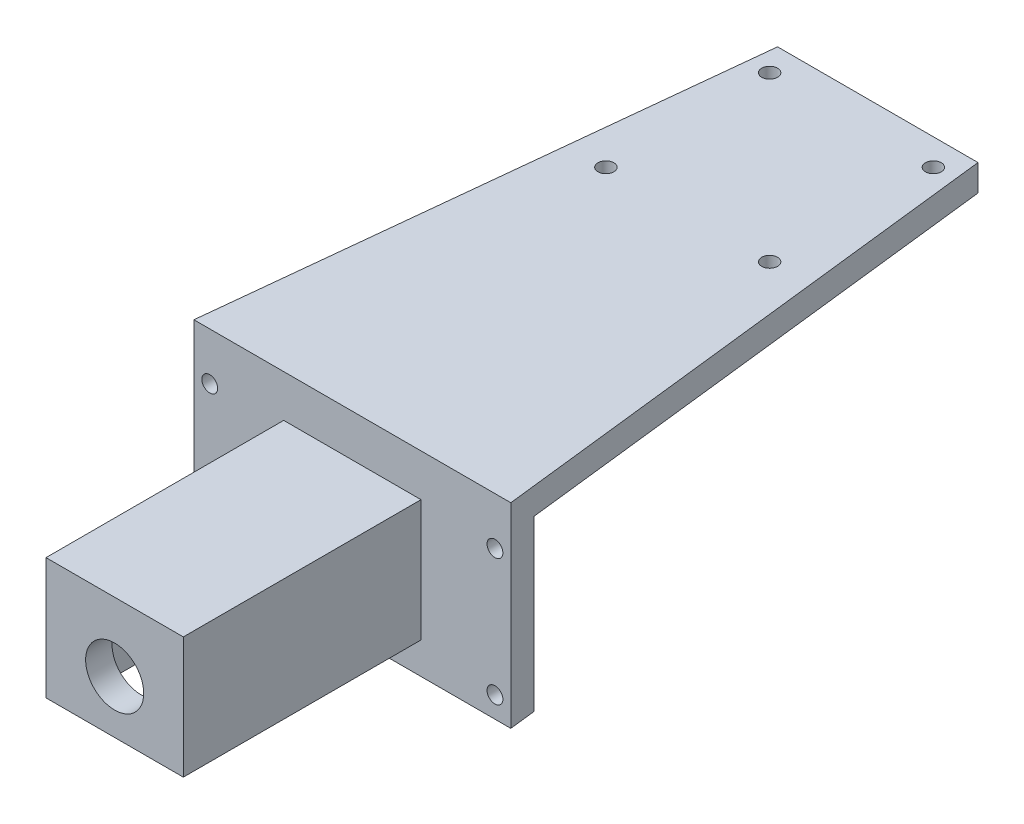
ISO-10303-21;
HEADER;
FILE_DESCRIPTION(('STEP AP214'),'2;1');
FILE_NAME('part.step','',(''),(''),'','','');
FILE_SCHEMA(('AUTOMOTIVE_DESIGN { 1 0 10303 214 1 1 1 1 }'));
ENDSEC;
DATA;
#1=APPLICATION_CONTEXT('core data for automotive mechanical design processes');
#2=APPLICATION_PROTOCOL_DEFINITION('international standard','automotive_design',2000,#1);
#3=PRODUCT_CONTEXT('',#1,'mechanical');
#4=PRODUCT('Part','Part','',(#3));
#5=PRODUCT_RELATED_PRODUCT_CATEGORY('part','',(#4));
#6=PRODUCT_DEFINITION_FORMATION('','',#4);
#7=PRODUCT_DEFINITION_CONTEXT('part definition',#1,'design');
#8=PRODUCT_DEFINITION('design','',#6,#7);
#9=PRODUCT_DEFINITION_SHAPE('','',#8);
#10=(LENGTH_UNIT() NAMED_UNIT(*) SI_UNIT(.MILLI.,.METRE.));
#11=(NAMED_UNIT(*) PLANE_ANGLE_UNIT() SI_UNIT($,.RADIAN.));
#12=(NAMED_UNIT(*) SI_UNIT($,.STERADIAN.) SOLID_ANGLE_UNIT());
#13=UNCERTAINTY_MEASURE_WITH_UNIT(LENGTH_MEASURE(1.E-05),#10,'distance_accuracy_value','');
#14=(GEOMETRIC_REPRESENTATION_CONTEXT(3) GLOBAL_UNCERTAINTY_ASSIGNED_CONTEXT((#13)) GLOBAL_UNIT_ASSIGNED_CONTEXT((#10,
#11,#12)) REPRESENTATION_CONTEXT('',''));
#15=CARTESIAN_POINT('',(0.,0.,0.));
#16=DIRECTION('',(0.,0.,1.));
#17=DIRECTION('',(1.,0.,0.));
#18=AXIS2_PLACEMENT_3D('',#15,#16,#17);
#19=CARTESIAN_POINT('',(0.,0.,5.));
#20=DIRECTION('',(0.,0.,1.));
#21=DIRECTION('',(1.,0.,0.));
#22=AXIS2_PLACEMENT_3D('',#19,#20,#21);
#23=PLANE('',#22);
#24=CARTESIAN_POINT('',(0.,0.,5.));
#25=DIRECTION('',(0.,0.,1.));
#26=DIRECTION('',(1.,0.,0.));
#27=AXIS2_PLACEMENT_3D('',#24,#25,#26);
#28=CIRCLE('',#27,5.);
#29=CARTESIAN_POINT('',(5.,0.,5.));
#30=VERTEX_POINT('',#29);
#31=EDGE_CURVE('E234',#30,#30,#28,.T.);
#32=ORIENTED_EDGE('',*,*,#31,.F.);
#33=EDGE_LOOP('',(#32));
#34=FACE_BOUND('',#33,.T.);
#35=CARTESIAN_POINT('',(-27.,12.,5.));
#36=DIRECTION('',(0.,0.,1.));
#37=DIRECTION('',(1.,0.,0.));
#38=AXIS2_PLACEMENT_3D('',#35,#36,#37);
#39=CIRCLE('',#38,1.5);
#40=CARTESIAN_POINT('',(-25.5,12.,5.));
#41=VERTEX_POINT('',#40);
#42=EDGE_CURVE('E240',#41,#41,#39,.T.);
#43=ORIENTED_EDGE('',*,*,#42,.F.);
#44=EDGE_LOOP('',(#43));
#45=FACE_BOUND('',#44,.T.);
#46=CARTESIAN_POINT('',(-27.,-12.,5.));
#47=DIRECTION('',(0.,0.,1.));
#48=DIRECTION('',(1.,0.,0.));
#49=AXIS2_PLACEMENT_3D('',#46,#47,#48);
#50=CIRCLE('',#49,1.5);
#51=CARTESIAN_POINT('',(-25.5,-12.,5.));
#52=VERTEX_POINT('',#51);
#53=EDGE_CURVE('E253',#52,#52,#50,.T.);
#54=ORIENTED_EDGE('',*,*,#53,.F.);
#55=EDGE_LOOP('',(#54));
#56=FACE_BOUND('',#55,.T.);
#57=CARTESIAN_POINT('',(27.,-12.,5.));
#58=DIRECTION('',(0.,0.,1.));
#59=DIRECTION('',(1.,0.,0.));
#60=AXIS2_PLACEMENT_3D('',#57,#58,#59);
#61=CIRCLE('',#60,1.5);
#62=CARTESIAN_POINT('',(28.5,-12.,5.));
#63=VERTEX_POINT('',#62);
#64=EDGE_CURVE('E247',#63,#63,#61,.T.);
#65=ORIENTED_EDGE('',*,*,#64,.F.);
#66=EDGE_LOOP('',(#65));
#67=FACE_BOUND('',#66,.T.);
#68=CARTESIAN_POINT('',(27.,12.,5.));
#69=DIRECTION('',(0.,0.,1.));
#70=DIRECTION('',(1.,0.,0.));
#71=AXIS2_PLACEMENT_3D('',#68,#69,#70);
#72=CIRCLE('',#71,1.5);
#73=CARTESIAN_POINT('',(28.5,12.,5.));
#74=VERTEX_POINT('',#73);
#75=EDGE_CURVE('E246',#74,#74,#72,.T.);
#76=ORIENTED_EDGE('',*,*,#75,.F.);
#77=EDGE_LOOP('',(#76));
#78=FACE_BOUND('',#77,.T.);
#79=DIRECTION('',(0.,-1.,0.));
#80=VECTOR('',#79,1.);
#81=CARTESIAN_POINT('',(-30.,-16.,5.));
#82=LINE('',#81,#80);
#83=CARTESIAN_POINT('',(-30.,21.,5.));
#84=VERTEX_POINT('',#83);
#85=CARTESIAN_POINT('',(-30.,-16.,5.));
#86=VERTEX_POINT('',#85);
#87=EDGE_CURVE('E267',#84,#86,#82,.T.);
#88=ORIENTED_EDGE('',*,*,#87,.T.);
#89=DIRECTION('',(1.,0.,0.));
#90=VECTOR('',#89,1.);
#91=CARTESIAN_POINT('',(30.,-16.,5.));
#92=LINE('',#91,#90);
#93=CARTESIAN_POINT('',(30.,-16.,5.));
#94=VERTEX_POINT('',#93);
#95=EDGE_CURVE('E270',#86,#94,#92,.T.);
#96=ORIENTED_EDGE('',*,*,#95,.T.);
#97=DIRECTION('',(0.,1.,0.));
#98=VECTOR('',#97,1.);
#99=CARTESIAN_POINT('',(30.,-16.,5.));
#100=LINE('',#99,#98);
#101=CARTESIAN_POINT('',(30.,21.,5.));
#102=VERTEX_POINT('',#101);
#103=EDGE_CURVE('E274',#94,#102,#100,.T.);
#104=ORIENTED_EDGE('',*,*,#103,.T.);
#105=DIRECTION('',(-1.,0.,0.));
#106=VECTOR('',#105,1.);
#107=CARTESIAN_POINT('',(-30.,21.,5.));
#108=LINE('',#107,#106);
#109=EDGE_CURVE('E227',#102,#84,#108,.T.);
#110=ORIENTED_EDGE('',*,*,#109,.T.);
#111=EDGE_LOOP('',(#88,#96,#104,#110));
#112=FACE_BOUND('',#111,.T.);
#113=DIRECTION('',(1.,0.,0.));
#114=VECTOR('',#113,1.);
#115=CARTESIAN_POINT('',(10.,10.,5.));
#116=LINE('',#115,#114);
#117=CARTESIAN_POINT('',(-10.,10.,5.));
#118=VERTEX_POINT('',#117);
#119=CARTESIAN_POINT('',(10.,10.,5.));
#120=VERTEX_POINT('',#119);
#121=EDGE_CURVE('E421',#118,#120,#116,.T.);
#122=ORIENTED_EDGE('',*,*,#121,.F.);
#123=DIRECTION('',(0.,1.,0.));
#124=VECTOR('',#123,1.);
#125=CARTESIAN_POINT('',(-10.,-10.,5.));
#126=LINE('',#125,#124);
#127=CARTESIAN_POINT('',(-10.,-10.,5.));
#128=VERTEX_POINT('',#127);
#129=EDGE_CURVE('E156',#128,#118,#126,.T.);
#130=ORIENTED_EDGE('',*,*,#129,.F.);
#131=DIRECTION('',(1.,0.,0.));
#132=VECTOR('',#131,1.);
#133=CARTESIAN_POINT('',(-10.,-10.,5.));
#134=LINE('',#133,#132);
#135=CARTESIAN_POINT('',(-13.,-10.,5.));
#136=VERTEX_POINT('',#135);
#137=EDGE_CURVE('E162',#136,#128,#134,.T.);
#138=ORIENTED_EDGE('',*,*,#137,.F.);
#139=DIRECTION('',(0.,-1.,0.));
#140=VECTOR('',#139,1.);
#141=CARTESIAN_POINT('',(-13.,-10.,5.));
#142=LINE('',#141,#140);
#143=CARTESIAN_POINT('',(-13.,13.,5.));
#144=VERTEX_POINT('',#143);
#145=EDGE_CURVE('E434',#144,#136,#142,.T.);
#146=ORIENTED_EDGE('',*,*,#145,.F.);
#147=DIRECTION('',(-1.,0.,0.));
#148=VECTOR('',#147,1.);
#149=CARTESIAN_POINT('',(13.,13.,5.));
#150=LINE('',#149,#148);
#151=CARTESIAN_POINT('',(13.,13.,5.));
#152=VERTEX_POINT('',#151);
#153=EDGE_CURVE('E432',#152,#144,#150,.T.);
#154=ORIENTED_EDGE('',*,*,#153,.F.);
#155=DIRECTION('',(0.,1.,0.));
#156=VECTOR('',#155,1.);
#157=CARTESIAN_POINT('',(13.,-10.,5.));
#158=LINE('',#157,#156);
#159=CARTESIAN_POINT('',(13.,-10.,5.));
#160=VERTEX_POINT('',#159);
#161=EDGE_CURVE('E429',#160,#152,#158,.T.);
#162=ORIENTED_EDGE('',*,*,#161,.F.);
#163=DIRECTION('',(1.,0.,0.));
#164=VECTOR('',#163,1.);
#165=CARTESIAN_POINT('',(13.,-10.,5.));
#166=LINE('',#165,#164);
#167=CARTESIAN_POINT('',(10.,-10.,5.));
#168=VERTEX_POINT('',#167);
#169=EDGE_CURVE('E427',#168,#160,#166,.T.);
#170=ORIENTED_EDGE('',*,*,#169,.F.);
#171=DIRECTION('',(0.,-1.,0.));
#172=VECTOR('',#171,1.);
#173=CARTESIAN_POINT('',(10.,-10.,5.));
#174=LINE('',#173,#172);
#175=EDGE_CURVE('E424',#120,#168,#174,.T.);
#176=ORIENTED_EDGE('',*,*,#175,.F.);
#177=EDGE_LOOP('',(#122,#130,#138,#146,#154,#162,#170,#176));
#178=FACE_BOUND('',#177,.T.);
#179=ADVANCED_FACE('F39',(#34,#45,#56,#67,#78,#112,#178),#23,.T.);
#180=CARTESIAN_POINT('',(30.,-16.,5.));
#181=DIRECTION('',(0.,1.,0.));
#182=DIRECTION('',(-1.,0.,0.));
#183=AXIS2_PLACEMENT_3D('',#180,#181,#182);
#184=PLANE('',#183);
#185=DIRECTION('',(1.,0.,0.));
#186=VECTOR('',#185,1.);
#187=CARTESIAN_POINT('',(30.,-16.,0.));
#188=LINE('',#187,#186);
#189=CARTESIAN_POINT('',(-29.4748422493676,-16.,0.));
#190=VERTEX_POINT('',#189);
#191=CARTESIAN_POINT('',(29.422452445928,-16.,0.));
#192=VERTEX_POINT('',#191);
#193=EDGE_CURVE('E264',#190,#192,#188,.T.);
#194=ORIENTED_EDGE('',*,*,#193,.T.);
#195=DIRECTION('',(0.114746547462079,0.,0.993394800593164));
#196=VECTOR('',#195,1.);
#197=CARTESIAN_POINT('',(30.,-16.,5.));
#198=LINE('',#197,#196);
#199=EDGE_CURVE('E200',#192,#94,#198,.T.);
#200=ORIENTED_EDGE('',*,*,#199,.T.);
#201=ORIENTED_EDGE('',*,*,#95,.F.);
#202=DIRECTION('',(0.104456965316863,0.,-0.994529407507285));
#203=VECTOR('',#202,1.);
#204=CARTESIAN_POINT('',(-29.3453245438075,-16.,-1.23313142959533));
#205=LINE('',#204,#203);
#206=EDGE_CURVE('E193',#86,#190,#205,.T.);
#207=ORIENTED_EDGE('',*,*,#206,.T.);
#208=EDGE_LOOP('',(#194,#200,#201,#207));
#209=FACE_BOUND('',#208,.T.);
#210=ADVANCED_FACE('F41',(#209),#184,.F.);
#211=CARTESIAN_POINT('',(0.,0.,0.));
#212=DIRECTION('',(0.,0.,1.));
#213=DIRECTION('',(1.,0.,0.));
#214=AXIS2_PLACEMENT_3D('',#211,#212,#213);
#215=PLANE('',#214);
#216=CARTESIAN_POINT('',(0.,0.,0.));
#217=DIRECTION('',(0.,0.,1.));
#218=DIRECTION('',(1.,0.,0.));
#219=AXIS2_PLACEMENT_3D('',#216,#217,#218);
#220=CIRCLE('',#219,5.);
#221=CARTESIAN_POINT('',(5.,0.,0.));
#222=VERTEX_POINT('',#221);
#223=EDGE_CURVE('E237',#222,#222,#220,.T.);
#224=ORIENTED_EDGE('',*,*,#223,.T.);
#225=EDGE_LOOP('',(#224));
#226=FACE_BOUND('',#225,.T.);
#227=CARTESIAN_POINT('',(-27.,12.,0.));
#228=DIRECTION('',(0.,0.,1.));
#229=DIRECTION('',(1.,0.,0.));
#230=AXIS2_PLACEMENT_3D('',#227,#228,#229);
#231=CIRCLE('',#230,1.5);
#232=CARTESIAN_POINT('',(-25.5,12.,0.));
#233=VERTEX_POINT('',#232);
#234=EDGE_CURVE('E256',#233,#233,#231,.T.);
#235=ORIENTED_EDGE('',*,*,#234,.T.);
#236=EDGE_LOOP('',(#235));
#237=FACE_BOUND('',#236,.T.);
#238=CARTESIAN_POINT('',(-27.,-12.,0.));
#239=DIRECTION('',(0.,0.,1.));
#240=DIRECTION('',(1.,0.,0.));
#241=AXIS2_PLACEMENT_3D('',#238,#239,#240);
#242=CIRCLE('',#241,1.5);
#243=CARTESIAN_POINT('',(-25.5,-12.,0.));
#244=VERTEX_POINT('',#243);
#245=EDGE_CURVE('E250',#244,#244,#242,.T.);
#246=ORIENTED_EDGE('',*,*,#245,.T.);
#247=EDGE_LOOP('',(#246));
#248=FACE_BOUND('',#247,.T.);
#249=CARTESIAN_POINT('',(27.,-12.,0.));
#250=DIRECTION('',(0.,0.,1.));
#251=DIRECTION('',(1.,0.,0.));
#252=AXIS2_PLACEMENT_3D('',#249,#250,#251);
#253=CIRCLE('',#252,1.5);
#254=CARTESIAN_POINT('',(28.5,-12.,0.));
#255=VERTEX_POINT('',#254);
#256=EDGE_CURVE('E243',#255,#255,#253,.T.);
#257=ORIENTED_EDGE('',*,*,#256,.T.);
#258=EDGE_LOOP('',(#257));
#259=FACE_BOUND('',#258,.T.);
#260=CARTESIAN_POINT('',(27.,12.,0.));
#261=DIRECTION('',(0.,0.,1.));
#262=DIRECTION('',(1.,0.,0.));
#263=AXIS2_PLACEMENT_3D('',#260,#261,#262);
#264=CIRCLE('',#263,1.5);
#265=CARTESIAN_POINT('',(28.5,12.,0.));
#266=VERTEX_POINT('',#265);
#267=EDGE_CURVE('E261',#266,#266,#264,.T.);
#268=ORIENTED_EDGE('',*,*,#267,.T.);
#269=EDGE_LOOP('',(#268));
#270=FACE_BOUND('',#269,.T.);
#271=DIRECTION('',(-1.,0.,0.));
#272=VECTOR('',#271,1.);
#273=CARTESIAN_POINT('',(30.,16.,0.));
#274=LINE('',#273,#272);
#275=CARTESIAN_POINT('',(29.422452445928,16.,0.));
#276=VERTEX_POINT('',#275);
#277=CARTESIAN_POINT('',(-29.4748422493676,16.,0.));
#278=VERTEX_POINT('',#277);
#279=EDGE_CURVE('E271',#276,#278,#274,.T.);
#280=ORIENTED_EDGE('',*,*,#279,.F.);
#281=DIRECTION('',(0.,-1.,0.));
#282=VECTOR('',#281,1.);
#283=CARTESIAN_POINT('',(29.422452445928,0.,0.));
#284=LINE('',#283,#282);
#285=EDGE_CURVE('E197',#276,#192,#284,.T.);
#286=ORIENTED_EDGE('',*,*,#285,.T.);
#287=ORIENTED_EDGE('',*,*,#193,.F.);
#288=DIRECTION('',(0.,1.,0.));
#289=VECTOR('',#288,1.);
#290=CARTESIAN_POINT('',(-29.4748422493676,0.,0.));
#291=LINE('',#290,#289);
#292=EDGE_CURVE('E190',#190,#278,#291,.T.);
#293=ORIENTED_EDGE('',*,*,#292,.T.);
#294=EDGE_LOOP('',(#280,#286,#287,#293));
#295=FACE_BOUND('',#294,.T.);
#296=ADVANCED_FACE('F305',(#226,#237,#248,#259,#270,#295),#215,.F.);
#297=CARTESIAN_POINT('',(27.,12.,0.));
#298=DIRECTION('',(0.,0.,1.));
#299=DIRECTION('',(1.,0.,0.));
#300=AXIS2_PLACEMENT_3D('',#297,#298,#299);
#301=CYLINDRICAL_SURFACE('',#300,1.5);
#302=ORIENTED_EDGE('',*,*,#267,.F.);
#303=EDGE_LOOP('',(#302));
#304=FACE_BOUND('',#303,.T.);
#305=ORIENTED_EDGE('',*,*,#75,.T.);
#306=EDGE_LOOP('',(#305));
#307=FACE_BOUND('',#306,.T.);
#308=ADVANCED_FACE('F307',(#304,#307),#301,.F.);
#309=CARTESIAN_POINT('',(27.,-12.,0.));
#310=DIRECTION('',(0.,0.,1.));
#311=DIRECTION('',(1.,0.,0.));
#312=AXIS2_PLACEMENT_3D('',#309,#310,#311);
#313=CYLINDRICAL_SURFACE('',#312,1.5);
#314=ORIENTED_EDGE('',*,*,#256,.F.);
#315=EDGE_LOOP('',(#314));
#316=FACE_BOUND('',#315,.T.);
#317=ORIENTED_EDGE('',*,*,#64,.T.);
#318=EDGE_LOOP('',(#317));
#319=FACE_BOUND('',#318,.T.);
#320=ADVANCED_FACE('F313',(#316,#319),#313,.F.);
#321=CARTESIAN_POINT('',(-27.,-12.,0.));
#322=DIRECTION('',(0.,0.,1.));
#323=DIRECTION('',(1.,0.,0.));
#324=AXIS2_PLACEMENT_3D('',#321,#322,#323);
#325=CYLINDRICAL_SURFACE('',#324,1.5);
#326=ORIENTED_EDGE('',*,*,#245,.F.);
#327=EDGE_LOOP('',(#326));
#328=FACE_BOUND('',#327,.T.);
#329=ORIENTED_EDGE('',*,*,#53,.T.);
#330=EDGE_LOOP('',(#329));
#331=FACE_BOUND('',#330,.T.);
#332=ADVANCED_FACE('F331',(#328,#331),#325,.F.);
#333=CARTESIAN_POINT('',(-27.,12.,0.));
#334=DIRECTION('',(0.,0.,1.));
#335=DIRECTION('',(1.,0.,0.));
#336=AXIS2_PLACEMENT_3D('',#333,#334,#335);
#337=CYLINDRICAL_SURFACE('',#336,1.5);
#338=ORIENTED_EDGE('',*,*,#234,.F.);
#339=EDGE_LOOP('',(#338));
#340=FACE_BOUND('',#339,.T.);
#341=ORIENTED_EDGE('',*,*,#42,.T.);
#342=EDGE_LOOP('',(#341));
#343=FACE_BOUND('',#342,.T.);
#344=ADVANCED_FACE('F327',(#340,#343),#337,.F.);
#345=CARTESIAN_POINT('',(0.,0.,0.));
#346=DIRECTION('',(0.,0.,1.));
#347=DIRECTION('',(1.,0.,0.));
#348=AXIS2_PLACEMENT_3D('',#345,#346,#347);
#349=CYLINDRICAL_SURFACE('',#348,5.);
#350=ORIENTED_EDGE('',*,*,#223,.F.);
#351=EDGE_LOOP('',(#350));
#352=FACE_BOUND('',#351,.T.);
#353=ORIENTED_EDGE('',*,*,#31,.T.);
#354=EDGE_LOOP('',(#353));
#355=FACE_BOUND('',#354,.T.);
#356=ADVANCED_FACE('F330',(#352,#355),#349,.F.);
#357=CARTESIAN_POINT('',(-30.,21.,-95.));
#358=DIRECTION('',(0.,1.,0.));
#359=DIRECTION('',(0.,0.,1.));
#360=AXIS2_PLACEMENT_3D('',#357,#358,#359);
#361=PLANE('',#360);
#362=DIRECTION('',(0.114746547462079,0.,0.993394800593164));
#363=VECTOR('',#362,1.);
#364=CARTESIAN_POINT('',(30.,21.,5.));
#365=LINE('',#364,#363);
#366=CARTESIAN_POINT('',(18.4490489185606,21.,-95.));
#367=VERTEX_POINT('',#366);
#368=EDGE_CURVE('E185',#367,#102,#365,.T.);
#369=ORIENTED_EDGE('',*,*,#368,.F.);
#370=DIRECTION('',(-1.,0.,0.));
#371=VECTOR('',#370,1.);
#372=CARTESIAN_POINT('',(-30.,21.,-95.));
#373=LINE('',#372,#371);
#374=CARTESIAN_POINT('',(-19.4968449873517,21.,-95.));
#375=VERTEX_POINT('',#374);
#376=EDGE_CURVE('E231',#367,#375,#373,.T.);
#377=ORIENTED_EDGE('',*,*,#376,.T.);
#378=DIRECTION('',(0.104456965316863,0.,-0.994529407507285));
#379=VECTOR('',#378,1.);
#380=CARTESIAN_POINT('',(-30.,21.,5.));
#381=LINE('',#380,#379);
#382=EDGE_CURVE('E184',#84,#375,#381,.T.);
#383=ORIENTED_EDGE('',*,*,#382,.F.);
#384=ORIENTED_EDGE('',*,*,#109,.F.);
#385=EDGE_LOOP('',(#369,#377,#383,#384));
#386=FACE_BOUND('',#385,.T.);
#387=CARTESIAN_POINT('',(-16.,21.,-59.));
#388=DIRECTION('',(0.,1.,0.));
#389=DIRECTION('',(0.,0.,1.));
#390=AXIS2_PLACEMENT_3D('',#387,#388,#389);
#391=CIRCLE('',#390,1.5);
#392=CARTESIAN_POINT('',(-16.,21.,-57.5));
#393=VERTEX_POINT('',#392);
#394=EDGE_CURVE('E224',#393,#393,#391,.T.);
#395=ORIENTED_EDGE('',*,*,#394,.F.);
#396=EDGE_LOOP('',(#395));
#397=FACE_BOUND('',#396,.T.);
#398=CARTESIAN_POINT('',(15.,21.,-90.));
#399=DIRECTION('',(0.,1.,0.));
#400=DIRECTION('',(0.,0.,1.));
#401=AXIS2_PLACEMENT_3D('',#398,#399,#400);
#402=CIRCLE('',#401,1.5);
#403=CARTESIAN_POINT('',(15.,21.,-88.5));
#404=VERTEX_POINT('',#403);
#405=EDGE_CURVE('E221',#404,#404,#402,.T.);
#406=ORIENTED_EDGE('',*,*,#405,.F.);
#407=EDGE_LOOP('',(#406));
#408=FACE_BOUND('',#407,.T.);
#409=CARTESIAN_POINT('',(-16.,21.,-90.));
#410=DIRECTION('',(0.,1.,0.));
#411=DIRECTION('',(0.,0.,1.));
#412=AXIS2_PLACEMENT_3D('',#409,#410,#411);
#413=CIRCLE('',#412,1.5);
#414=CARTESIAN_POINT('',(-16.,21.,-88.5));
#415=VERTEX_POINT('',#414);
#416=EDGE_CURVE('E218',#415,#415,#413,.T.);
#417=ORIENTED_EDGE('',*,*,#416,.F.);
#418=EDGE_LOOP('',(#417));
#419=FACE_BOUND('',#418,.T.);
#420=CARTESIAN_POINT('',(15.,21.,-59.));
#421=DIRECTION('',(0.,1.,0.));
#422=DIRECTION('',(0.,0.,1.));
#423=AXIS2_PLACEMENT_3D('',#420,#421,#422);
#424=CIRCLE('',#423,1.5);
#425=CARTESIAN_POINT('',(15.,21.,-57.5));
#426=VERTEX_POINT('',#425);
#427=EDGE_CURVE('E215',#426,#426,#424,.T.);
#428=ORIENTED_EDGE('',*,*,#427,.F.);
#429=EDGE_LOOP('',(#428));
#430=FACE_BOUND('',#429,.T.);
#431=ADVANCED_FACE('F297',(#386,#397,#408,#419,#430),#361,.T.);
#432=CARTESIAN_POINT('',(-30.,16.,-95.));
#433=DIRECTION('',(0.,-1.,0.));
#434=DIRECTION('',(0.,0.,-1.));
#435=AXIS2_PLACEMENT_3D('',#432,#433,#434);
#436=PLANE('',#435);
#437=DIRECTION('',(-0.114746547462079,0.,-0.993394800593164));
#438=VECTOR('',#437,1.);
#439=CARTESIAN_POINT('',(17.8111314272474,16.,-100.522640402644));
#440=LINE('',#439,#438);
#441=CARTESIAN_POINT('',(18.4490489185606,16.,-95.));
#442=VERTEX_POINT('',#441);
#443=EDGE_CURVE('E61',#276,#442,#440,.T.);
#444=ORIENTED_EDGE('',*,*,#443,.F.);
#445=ORIENTED_EDGE('',*,*,#279,.T.);
#446=DIRECTION('',(-0.104456965316863,0.,0.994529407507285));
#447=VECTOR('',#446,1.);
#448=CARTESIAN_POINT('',(-19.6114476173411,16.,-93.9088742396792));
#449=LINE('',#448,#447);
#450=CARTESIAN_POINT('',(-19.4968449873517,16.,-95.));
#451=VERTEX_POINT('',#450);
#452=EDGE_CURVE('E187',#451,#278,#449,.T.);
#453=ORIENTED_EDGE('',*,*,#452,.F.);
#454=DIRECTION('',(1.,0.,0.));
#455=VECTOR('',#454,1.);
#456=CARTESIAN_POINT('',(-30.,16.,-95.));
#457=LINE('',#456,#455);
#458=EDGE_CURVE('E228',#451,#442,#457,.T.);
#459=ORIENTED_EDGE('',*,*,#458,.T.);
#460=EDGE_LOOP('',(#444,#445,#453,#459));
#461=FACE_BOUND('',#460,.T.);
#462=CARTESIAN_POINT('',(-16.,16.,-59.));
#463=DIRECTION('',(0.,-1.,0.));
#464=DIRECTION('',(0.,0.,-1.));
#465=AXIS2_PLACEMENT_3D('',#462,#463,#464);
#466=CIRCLE('',#465,1.5);
#467=CARTESIAN_POINT('',(-16.,16.,-60.5));
#468=VERTEX_POINT('',#467);
#469=EDGE_CURVE('E207',#468,#468,#466,.T.);
#470=ORIENTED_EDGE('',*,*,#469,.F.);
#471=EDGE_LOOP('',(#470));
#472=FACE_BOUND('',#471,.T.);
#473=CARTESIAN_POINT('',(15.,16.,-90.));
#474=DIRECTION('',(0.,-1.,0.));
#475=DIRECTION('',(0.,0.,-1.));
#476=AXIS2_PLACEMENT_3D('',#473,#474,#475);
#477=CIRCLE('',#476,1.5);
#478=CARTESIAN_POINT('',(15.,16.,-91.5));
#479=VERTEX_POINT('',#478);
#480=EDGE_CURVE('E206',#479,#479,#477,.T.);
#481=ORIENTED_EDGE('',*,*,#480,.F.);
#482=EDGE_LOOP('',(#481));
#483=FACE_BOUND('',#482,.T.);
#484=CARTESIAN_POINT('',(-16.,16.,-90.));
#485=DIRECTION('',(0.,-1.,0.));
#486=DIRECTION('',(0.,0.,-1.));
#487=AXIS2_PLACEMENT_3D('',#484,#485,#486);
#488=CIRCLE('',#487,1.5);
#489=CARTESIAN_POINT('',(-16.,16.,-91.5));
#490=VERTEX_POINT('',#489);
#491=EDGE_CURVE('E203',#490,#490,#488,.T.);
#492=ORIENTED_EDGE('',*,*,#491,.F.);
#493=EDGE_LOOP('',(#492));
#494=FACE_BOUND('',#493,.T.);
#495=CARTESIAN_POINT('',(15.,16.,-59.));
#496=DIRECTION('',(0.,-1.,0.));
#497=DIRECTION('',(0.,0.,-1.));
#498=AXIS2_PLACEMENT_3D('',#495,#496,#497);
#499=CIRCLE('',#498,1.5);
#500=CARTESIAN_POINT('',(15.,16.,-60.5));
#501=VERTEX_POINT('',#500);
#502=EDGE_CURVE('E210',#501,#501,#499,.T.);
#503=ORIENTED_EDGE('',*,*,#502,.F.);
#504=EDGE_LOOP('',(#503));
#505=FACE_BOUND('',#504,.T.);
#506=ADVANCED_FACE('F289',(#461,#472,#483,#494,#505),#436,.T.);
#507=CARTESIAN_POINT('',(0.,0.,-95.));
#508=DIRECTION('',(0.,0.,-1.));
#509=DIRECTION('',(-1.,0.,0.));
#510=AXIS2_PLACEMENT_3D('',#507,#508,#509);
#511=PLANE('',#510);
#512=DIRECTION('',(0.,1.,0.));
#513=VECTOR('',#512,1.);
#514=CARTESIAN_POINT('',(18.4490489185606,0.,-95.));
#515=LINE('',#514,#513);
#516=EDGE_CURVE('E11',#442,#367,#515,.T.);
#517=ORIENTED_EDGE('',*,*,#516,.F.);
#518=ORIENTED_EDGE('',*,*,#458,.F.);
#519=DIRECTION('',(0.,-1.,0.));
#520=VECTOR('',#519,1.);
#521=CARTESIAN_POINT('',(-19.4968449873517,0.,-95.));
#522=LINE('',#521,#520);
#523=EDGE_CURVE('E47',#375,#451,#522,.T.);
#524=ORIENTED_EDGE('',*,*,#523,.F.);
#525=ORIENTED_EDGE('',*,*,#376,.F.);
#526=EDGE_LOOP('',(#517,#518,#524,#525));
#527=FACE_BOUND('',#526,.T.);
#528=ADVANCED_FACE('F292',(#527),#511,.T.);
#529=CARTESIAN_POINT('',(15.,116.,-59.));
#530=DIRECTION('',(0.,-1.,0.));
#531=DIRECTION('',(0.,0.,-1.));
#532=AXIS2_PLACEMENT_3D('',#529,#530,#531);
#533=CYLINDRICAL_SURFACE('',#532,1.5);
#534=ORIENTED_EDGE('',*,*,#427,.T.);
#535=EDGE_LOOP('',(#534));
#536=FACE_BOUND('',#535,.T.);
#537=ORIENTED_EDGE('',*,*,#502,.T.);
#538=EDGE_LOOP('',(#537));
#539=FACE_BOUND('',#538,.T.);
#540=ADVANCED_FACE('F348',(#536,#539),#533,.F.);
#541=CARTESIAN_POINT('',(-16.,116.,-90.));
#542=DIRECTION('',(0.,-1.,0.));
#543=DIRECTION('',(0.,0.,-1.));
#544=AXIS2_PLACEMENT_3D('',#541,#542,#543);
#545=CYLINDRICAL_SURFACE('',#544,1.5);
#546=ORIENTED_EDGE('',*,*,#416,.T.);
#547=EDGE_LOOP('',(#546));
#548=FACE_BOUND('',#547,.T.);
#549=ORIENTED_EDGE('',*,*,#491,.T.);
#550=EDGE_LOOP('',(#549));
#551=FACE_BOUND('',#550,.T.);
#552=ADVANCED_FACE('F351',(#548,#551),#545,.F.);
#553=CARTESIAN_POINT('',(15.,116.,-90.));
#554=DIRECTION('',(0.,-1.,0.));
#555=DIRECTION('',(0.,0.,-1.));
#556=AXIS2_PLACEMENT_3D('',#553,#554,#555);
#557=CYLINDRICAL_SURFACE('',#556,1.5);
#558=ORIENTED_EDGE('',*,*,#405,.T.);
#559=EDGE_LOOP('',(#558));
#560=FACE_BOUND('',#559,.T.);
#561=ORIENTED_EDGE('',*,*,#480,.T.);
#562=EDGE_LOOP('',(#561));
#563=FACE_BOUND('',#562,.T.);
#564=ADVANCED_FACE('F353',(#560,#563),#557,.F.);
#565=CARTESIAN_POINT('',(-16.,116.,-59.));
#566=DIRECTION('',(0.,-1.,0.));
#567=DIRECTION('',(0.,0.,-1.));
#568=AXIS2_PLACEMENT_3D('',#565,#566,#567);
#569=CYLINDRICAL_SURFACE('',#568,1.5);
#570=ORIENTED_EDGE('',*,*,#394,.T.);
#571=EDGE_LOOP('',(#570));
#572=FACE_BOUND('',#571,.T.);
#573=ORIENTED_EDGE('',*,*,#469,.T.);
#574=EDGE_LOOP('',(#573));
#575=FACE_BOUND('',#574,.T.);
#576=ADVANCED_FACE('F356',(#572,#575),#569,.F.);
#577=CARTESIAN_POINT('',(-30.,-79.,5.));
#578=DIRECTION('',(0.994529407507285,0.,0.104456965316863));
#579=DIRECTION('',(0.104456965316863,0.,-0.994529407507285));
#580=AXIS2_PLACEMENT_3D('',#577,#578,#579);
#581=PLANE('',#580);
#582=ORIENTED_EDGE('',*,*,#87,.F.);
#583=ORIENTED_EDGE('',*,*,#382,.T.);
#584=ORIENTED_EDGE('',*,*,#523,.T.);
#585=ORIENTED_EDGE('',*,*,#452,.T.);
#586=ORIENTED_EDGE('',*,*,#292,.F.);
#587=ORIENTED_EDGE('',*,*,#206,.F.);
#588=EDGE_LOOP('',(#582,#583,#584,#585,#586,#587));
#589=FACE_BOUND('',#588,.T.);
#590=ADVANCED_FACE('F283',(#589),#581,.F.);
#591=CARTESIAN_POINT('',(30.,-79.,5.));
#592=DIRECTION('',(-0.993394800593164,0.,0.114746547462079));
#593=DIRECTION('',(0.114746547462079,0.,0.993394800593164));
#594=AXIS2_PLACEMENT_3D('',#591,#592,#593);
#595=PLANE('',#594);
#596=ORIENTED_EDGE('',*,*,#285,.F.);
#597=ORIENTED_EDGE('',*,*,#443,.T.);
#598=ORIENTED_EDGE('',*,*,#516,.T.);
#599=ORIENTED_EDGE('',*,*,#368,.T.);
#600=ORIENTED_EDGE('',*,*,#103,.F.);
#601=ORIENTED_EDGE('',*,*,#199,.F.);
#602=EDGE_LOOP('',(#596,#597,#598,#599,#600,#601));
#603=FACE_BOUND('',#602,.T.);
#604=ADVANCED_FACE('F294',(#603),#595,.F.);
#605=CARTESIAN_POINT('',(-10.,-10.,50.));
#606=DIRECTION('',(-1.,0.,0.));
#607=DIRECTION('',(0.,-1.,0.));
#608=AXIS2_PLACEMENT_3D('',#605,#606,#607);
#609=PLANE('',#608);
#610=DIRECTION('',(0.,0.,-1.));
#611=VECTOR('',#610,1.);
#612=CARTESIAN_POINT('',(-10.,10.,50.));
#613=LINE('',#612,#611);
#614=CARTESIAN_POINT('',(-10.,10.,45.));
#615=VERTEX_POINT('',#614);
#616=EDGE_CURVE('E155',#615,#118,#613,.T.);
#617=ORIENTED_EDGE('',*,*,#616,.F.);
#618=DIRECTION('',(0.,-1.,0.));
#619=VECTOR('',#618,1.);
#620=CARTESIAN_POINT('',(-10.,-10.,45.));
#621=LINE('',#620,#619);
#622=CARTESIAN_POINT('',(-10.,-10.,45.));
#623=VERTEX_POINT('',#622);
#624=EDGE_CURVE('E142',#615,#623,#621,.T.);
#625=ORIENTED_EDGE('',*,*,#624,.T.);
#626=DIRECTION('',(0.,0.,-1.));
#627=VECTOR('',#626,1.);
#628=CARTESIAN_POINT('',(-10.,-10.,50.));
#629=LINE('',#628,#627);
#630=EDGE_CURVE('E154',#623,#128,#629,.T.);
#631=ORIENTED_EDGE('',*,*,#630,.T.);
#632=ORIENTED_EDGE('',*,*,#129,.T.);
#633=EDGE_LOOP('',(#617,#625,#631,#632));
#634=FACE_BOUND('',#633,.T.);
#635=ADVANCED_FACE('F152',(#634),#609,.F.);
#636=CARTESIAN_POINT('',(10.,10.,50.));
#637=DIRECTION('',(0.,1.,0.));
#638=DIRECTION('',(-1.,0.,0.));
#639=AXIS2_PLACEMENT_3D('',#636,#637,#638);
#640=PLANE('',#639);
#641=DIRECTION('',(0.,0.,-1.));
#642=VECTOR('',#641,1.);
#643=CARTESIAN_POINT('',(10.,10.,50.));
#644=LINE('',#643,#642);
#645=CARTESIAN_POINT('',(10.,10.,45.));
#646=VERTEX_POINT('',#645);
#647=EDGE_CURVE('E181',#646,#120,#644,.T.);
#648=ORIENTED_EDGE('',*,*,#647,.F.);
#649=DIRECTION('',(-1.,0.,0.));
#650=VECTOR('',#649,1.);
#651=CARTESIAN_POINT('',(10.,10.,45.));
#652=LINE('',#651,#650);
#653=EDGE_CURVE('E157',#646,#615,#652,.T.);
#654=ORIENTED_EDGE('',*,*,#653,.T.);
#655=ORIENTED_EDGE('',*,*,#616,.T.);
#656=ORIENTED_EDGE('',*,*,#121,.T.);
#657=EDGE_LOOP('',(#648,#654,#655,#656));
#658=FACE_BOUND('',#657,.T.);
#659=ADVANCED_FACE('F370',(#658),#640,.F.);
#660=CARTESIAN_POINT('',(10.,-10.,50.));
#661=DIRECTION('',(1.,0.,0.));
#662=DIRECTION('',(0.,0.,-1.));
#663=AXIS2_PLACEMENT_3D('',#660,#661,#662);
#664=PLANE('',#663);
#665=DIRECTION('',(0.,0.,-1.));
#666=VECTOR('',#665,1.);
#667=CARTESIAN_POINT('',(10.,-10.,50.));
#668=LINE('',#667,#666);
#669=CARTESIAN_POINT('',(10.,-10.,45.));
#670=VERTEX_POINT('',#669);
#671=EDGE_CURVE('E179',#670,#168,#668,.T.);
#672=ORIENTED_EDGE('',*,*,#671,.F.);
#673=DIRECTION('',(0.,1.,0.));
#674=VECTOR('',#673,1.);
#675=CARTESIAN_POINT('',(10.,-10.,45.));
#676=LINE('',#675,#674);
#677=EDGE_CURVE('E145',#670,#646,#676,.T.);
#678=ORIENTED_EDGE('',*,*,#677,.T.);
#679=ORIENTED_EDGE('',*,*,#647,.T.);
#680=ORIENTED_EDGE('',*,*,#175,.T.);
#681=EDGE_LOOP('',(#672,#678,#679,#680));
#682=FACE_BOUND('',#681,.T.);
#683=ADVANCED_FACE('F373',(#682),#664,.F.);
#684=CARTESIAN_POINT('',(13.,-10.,50.));
#685=DIRECTION('',(0.,1.,0.));
#686=DIRECTION('',(0.,0.,1.));
#687=AXIS2_PLACEMENT_3D('',#684,#685,#686);
#688=PLANE('',#687);
#689=ORIENTED_EDGE('',*,*,#169,.T.);
#690=DIRECTION('',(0.,0.,-1.));
#691=VECTOR('',#690,1.);
#692=CARTESIAN_POINT('',(13.,-10.,50.));
#693=LINE('',#692,#691);
#694=CARTESIAN_POINT('',(13.,-10.,50.));
#695=VERTEX_POINT('',#694);
#696=EDGE_CURVE('E177',#695,#160,#693,.T.);
#697=ORIENTED_EDGE('',*,*,#696,.F.);
#698=DIRECTION('',(1.,0.,0.));
#699=VECTOR('',#698,1.);
#700=CARTESIAN_POINT('',(13.,-10.,50.));
#701=LINE('',#700,#699);
#702=CARTESIAN_POINT('',(-13.,-10.,50.));
#703=VERTEX_POINT('',#702);
#704=EDGE_CURVE('E415',#703,#695,#701,.T.);
#705=ORIENTED_EDGE('',*,*,#704,.F.);
#706=DIRECTION('',(0.,0.,-1.));
#707=VECTOR('',#706,1.);
#708=CARTESIAN_POINT('',(-13.,-10.,50.));
#709=LINE('',#708,#707);
#710=EDGE_CURVE('E54',#703,#136,#709,.T.);
#711=ORIENTED_EDGE('',*,*,#710,.T.);
#712=ORIENTED_EDGE('',*,*,#137,.T.);
#713=ORIENTED_EDGE('',*,*,#630,.F.);
#714=DIRECTION('',(1.,0.,0.));
#715=VECTOR('',#714,1.);
#716=CARTESIAN_POINT('',(-13.,-10.,45.));
#717=LINE('',#716,#715);
#718=EDGE_CURVE('E139',#623,#670,#717,.T.);
#719=ORIENTED_EDGE('',*,*,#718,.T.);
#720=ORIENTED_EDGE('',*,*,#671,.T.);
#721=EDGE_LOOP('',(#689,#697,#705,#711,#712,#713,#719,#720));
#722=FACE_BOUND('',#721,.T.);
#723=ADVANCED_FACE('F160',(#722),#688,.F.);
#724=CARTESIAN_POINT('',(13.,-10.,50.));
#725=DIRECTION('',(-1.,0.,0.));
#726=DIRECTION('',(0.,0.,1.));
#727=AXIS2_PLACEMENT_3D('',#724,#725,#726);
#728=PLANE('',#727);
#729=ORIENTED_EDGE('',*,*,#161,.T.);
#730=DIRECTION('',(0.,0.,-1.));
#731=VECTOR('',#730,1.);
#732=CARTESIAN_POINT('',(13.,13.,50.));
#733=LINE('',#732,#731);
#734=CARTESIAN_POINT('',(13.,13.,50.));
#735=VERTEX_POINT('',#734);
#736=EDGE_CURVE('E175',#735,#152,#733,.T.);
#737=ORIENTED_EDGE('',*,*,#736,.F.);
#738=DIRECTION('',(0.,1.,0.));
#739=VECTOR('',#738,1.);
#740=CARTESIAN_POINT('',(13.,-10.,50.));
#741=LINE('',#740,#739);
#742=EDGE_CURVE('E417',#695,#735,#741,.T.);
#743=ORIENTED_EDGE('',*,*,#742,.F.);
#744=ORIENTED_EDGE('',*,*,#696,.T.);
#745=EDGE_LOOP('',(#729,#737,#743,#744));
#746=FACE_BOUND('',#745,.T.);
#747=ADVANCED_FACE('F380',(#746),#728,.F.);
#748=CARTESIAN_POINT('',(13.,13.,50.));
#749=DIRECTION('',(0.,-1.,0.));
#750=DIRECTION('',(1.,0.,0.));
#751=AXIS2_PLACEMENT_3D('',#748,#749,#750);
#752=PLANE('',#751);
#753=ORIENTED_EDGE('',*,*,#153,.T.);
#754=DIRECTION('',(0.,0.,-1.));
#755=VECTOR('',#754,1.);
#756=CARTESIAN_POINT('',(-13.,13.,50.));
#757=LINE('',#756,#755);
#758=CARTESIAN_POINT('',(-13.,13.,50.));
#759=VERTEX_POINT('',#758);
#760=EDGE_CURVE('E166',#759,#144,#757,.T.);
#761=ORIENTED_EDGE('',*,*,#760,.F.);
#762=DIRECTION('',(-1.,0.,0.));
#763=VECTOR('',#762,1.);
#764=CARTESIAN_POINT('',(13.,13.,50.));
#765=LINE('',#764,#763);
#766=EDGE_CURVE('E169',#735,#759,#765,.T.);
#767=ORIENTED_EDGE('',*,*,#766,.F.);
#768=ORIENTED_EDGE('',*,*,#736,.T.);
#769=EDGE_LOOP('',(#753,#761,#767,#768));
#770=FACE_BOUND('',#769,.T.);
#771=ADVANCED_FACE('F383',(#770),#752,.F.);
#772=CARTESIAN_POINT('',(-13.,-10.,50.));
#773=DIRECTION('',(1.,0.,0.));
#774=DIRECTION('',(0.,0.,-1.));
#775=AXIS2_PLACEMENT_3D('',#772,#773,#774);
#776=PLANE('',#775);
#777=ORIENTED_EDGE('',*,*,#145,.T.);
#778=ORIENTED_EDGE('',*,*,#710,.F.);
#779=DIRECTION('',(0.,-1.,0.));
#780=VECTOR('',#779,1.);
#781=CARTESIAN_POINT('',(-13.,-10.,50.));
#782=LINE('',#781,#780);
#783=EDGE_CURVE('E164',#759,#703,#782,.T.);
#784=ORIENTED_EDGE('',*,*,#783,.F.);
#785=ORIENTED_EDGE('',*,*,#760,.T.);
#786=EDGE_LOOP('',(#777,#778,#784,#785));
#787=FACE_BOUND('',#786,.T.);
#788=ADVANCED_FACE('F387',(#787),#776,.F.);
#789=CARTESIAN_POINT('',(0.,0.,50.));
#790=DIRECTION('',(0.,0.,1.));
#791=DIRECTION('',(1.,0.,0.));
#792=AXIS2_PLACEMENT_3D('',#789,#790,#791);
#793=PLANE('',#792);
#794=CARTESIAN_POINT('',(0.,0.,50.));
#795=DIRECTION('',(0.,0.,1.));
#796=DIRECTION('',(1.,0.,0.));
#797=AXIS2_PLACEMENT_3D('',#794,#795,#796);
#798=CIRCLE('',#797,5.5);
#799=CARTESIAN_POINT('',(5.5,0.,50.));
#800=VERTEX_POINT('',#799);
#801=EDGE_CURVE('E409',#800,#800,#798,.T.);
#802=ORIENTED_EDGE('',*,*,#801,.F.);
#803=EDGE_LOOP('',(#802));
#804=FACE_BOUND('',#803,.T.);
#805=ORIENTED_EDGE('',*,*,#783,.T.);
#806=ORIENTED_EDGE('',*,*,#704,.T.);
#807=ORIENTED_EDGE('',*,*,#742,.T.);
#808=ORIENTED_EDGE('',*,*,#766,.T.);
#809=EDGE_LOOP('',(#805,#806,#807,#808));
#810=FACE_BOUND('',#809,.T.);
#811=ADVANCED_FACE('F391',(#804,#810),#793,.T.);
#812=CARTESIAN_POINT('',(0.,0.,45.));
#813=DIRECTION('',(0.,0.,-1.));
#814=DIRECTION('',(-1.,0.,0.));
#815=AXIS2_PLACEMENT_3D('',#812,#813,#814);
#816=PLANE('',#815);
#817=CARTESIAN_POINT('',(0.,0.,45.));
#818=DIRECTION('',(0.,0.,1.));
#819=DIRECTION('',(1.,0.,0.));
#820=AXIS2_PLACEMENT_3D('',#817,#818,#819);
#821=CIRCLE('',#820,5.5);
#822=CARTESIAN_POINT('',(5.5,0.,45.));
#823=VERTEX_POINT('',#822);
#824=EDGE_CURVE('E148',#823,#823,#821,.T.);
#825=ORIENTED_EDGE('',*,*,#824,.T.);
#826=EDGE_LOOP('',(#825));
#827=FACE_BOUND('',#826,.T.);
#828=ORIENTED_EDGE('',*,*,#624,.F.);
#829=ORIENTED_EDGE('',*,*,#653,.F.);
#830=ORIENTED_EDGE('',*,*,#677,.F.);
#831=ORIENTED_EDGE('',*,*,#718,.F.);
#832=EDGE_LOOP('',(#828,#829,#830,#831));
#833=FACE_BOUND('',#832,.T.);
#834=ADVANCED_FACE('F141',(#827,#833),#816,.T.);
#835=CARTESIAN_POINT('',(0.,0.,45.));
#836=DIRECTION('',(0.,0.,1.));
#837=DIRECTION('',(1.,0.,0.));
#838=AXIS2_PLACEMENT_3D('',#835,#836,#837);
#839=CYLINDRICAL_SURFACE('',#838,5.5);
#840=ORIENTED_EDGE('',*,*,#824,.F.);
#841=EDGE_LOOP('',(#840));
#842=FACE_BOUND('',#841,.T.);
#843=ORIENTED_EDGE('',*,*,#801,.T.);
#844=EDGE_LOOP('',(#843));
#845=FACE_BOUND('',#844,.T.);
#846=ADVANCED_FACE('F398',(#842,#845),#839,.F.);
#847=CLOSED_SHELL('',(#179,#210,#296,#308,#320,#332,#344,#356,#431,#506,#528,#540,#552,#564,
#576,#590,#604,#635,#659,#683,#723,#747,#771,#788,#811,#834,#846));
#848=MANIFOLD_SOLID_BREP('B2',#847);
#849=ADVANCED_BREP_SHAPE_REPRESENTATION('',(#18,#848),#14);
#850=SHAPE_DEFINITION_REPRESENTATION(#9,#849);
ENDSEC;
END-ISO-10303-21;
